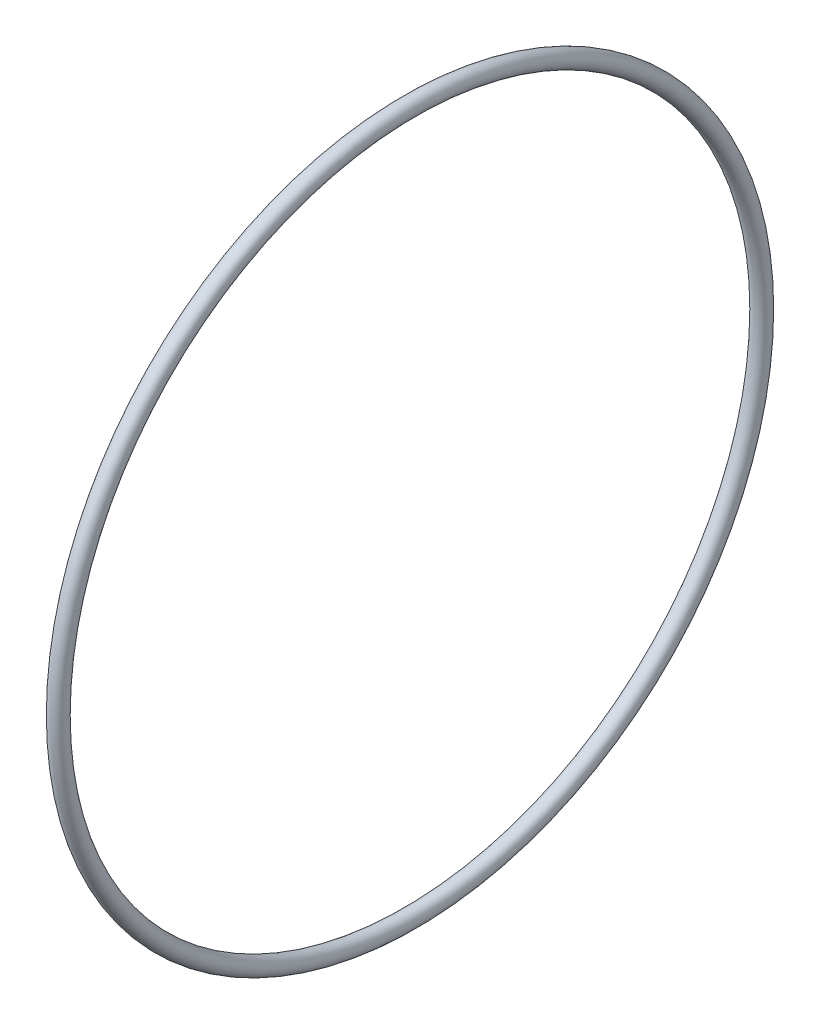
ISO-10303-21;
HEADER;
FILE_DESCRIPTION(('STEP AP214'),'2;1');
FILE_NAME('part.step','',(''),(''),'','','');
FILE_SCHEMA(('AUTOMOTIVE_DESIGN { 1 0 10303 214 1 1 1 1 }'));
ENDSEC;
DATA;
#1=APPLICATION_CONTEXT('core data for automotive mechanical design processes');
#2=APPLICATION_PROTOCOL_DEFINITION('international standard','automotive_design',2000,#1);
#3=PRODUCT_CONTEXT('',#1,'mechanical');
#4=PRODUCT('Part','Part','',(#3));
#5=PRODUCT_RELATED_PRODUCT_CATEGORY('part','',(#4));
#6=PRODUCT_DEFINITION_FORMATION('','',#4);
#7=PRODUCT_DEFINITION_CONTEXT('part definition',#1,'design');
#8=PRODUCT_DEFINITION('design','',#6,#7);
#9=PRODUCT_DEFINITION_SHAPE('','',#8);
#10=(LENGTH_UNIT() NAMED_UNIT(*) SI_UNIT(.MILLI.,.METRE.));
#11=(NAMED_UNIT(*) PLANE_ANGLE_UNIT() SI_UNIT($,.RADIAN.));
#12=(NAMED_UNIT(*) SI_UNIT($,.STERADIAN.) SOLID_ANGLE_UNIT());
#13=UNCERTAINTY_MEASURE_WITH_UNIT(LENGTH_MEASURE(1.E-05),#10,'distance_accuracy_value','');
#14=(GEOMETRIC_REPRESENTATION_CONTEXT(3) GLOBAL_UNCERTAINTY_ASSIGNED_CONTEXT((#13)) GLOBAL_UNIT_ASSIGNED_CONTEXT((#10,
#11,#12)) REPRESENTATION_CONTEXT('',''));
#15=CARTESIAN_POINT('',(0.,0.,0.));
#16=DIRECTION('',(0.,0.,1.));
#17=DIRECTION('',(1.,0.,0.));
#18=AXIS2_PLACEMENT_3D('',#15,#16,#17);
#19=CARTESIAN_POINT('',(0.,0.,0.));
#20=DIRECTION('',(1.,0.,0.));
#21=DIRECTION('',(0.,0.,-1.));
#22=AXIS2_PLACEMENT_3D('',#19,#20,#21);
#23=TOROIDAL_SURFACE('',#22,62.5,1.5);
#24=CARTESIAN_POINT('',(0.,0.,-62.5));
#25=DIRECTION('',(0.,1.,0.));
#26=DIRECTION('',(0.,0.,1.));
#27=AXIS2_PLACEMENT_3D('',#24,#25,#26);
#28=CIRCLE('',#27,1.5);
#29=CARTESIAN_POINT('',(0.,0.,-64.));
#30=VERTEX_POINT('',#29);
#31=EDGE_CURVE('E11',#30,#30,#28,.T.);
#32=CARTESIAN_POINT('',(0.,0.,0.));
#33=DIRECTION('',(1.,0.,0.));
#34=DIRECTION('',(0.,0.,-1.));
#35=AXIS2_PLACEMENT_3D('',#32,#33,#34);
#36=CIRCLE('',#35,64.);
#37=EDGE_CURVE('',#30,#30,#36,.T.);
#38=ORIENTED_EDGE('',*,*,#31,.T.);
#39=ORIENTED_EDGE('',*,*,#31,.F.);
#40=ORIENTED_EDGE('',*,*,#37,.T.);
#41=ORIENTED_EDGE('',*,*,#37,.F.);
#42=EDGE_LOOP('',(#38,#40,#39,#41));
#43=FACE_BOUND('',#42,.T.);
#44=ADVANCED_FACE('F51',(#43),#23,.T.);
#45=CLOSED_SHELL('',(#44));
#46=MANIFOLD_SOLID_BREP('B2',#45);
#47=ADVANCED_BREP_SHAPE_REPRESENTATION('',(#18,#46),#14);
#48=SHAPE_DEFINITION_REPRESENTATION(#9,#47);
ENDSEC;
END-ISO-10303-21;
